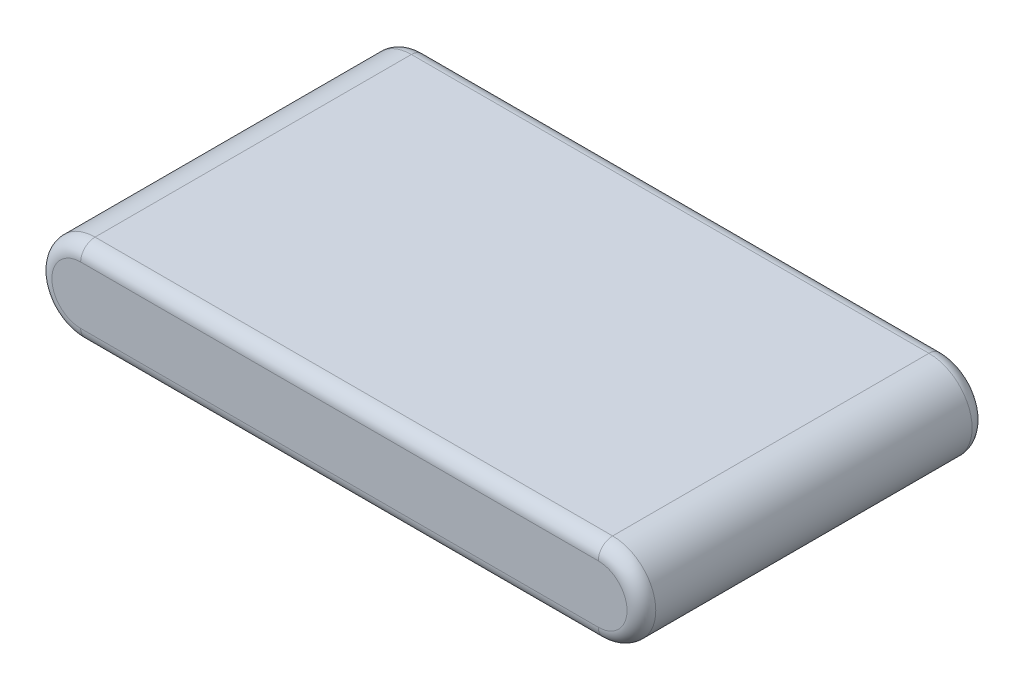
ISO-10303-21;
HEADER;
FILE_DESCRIPTION(('STEP AP214'),'2;1');
FILE_NAME('part.step','',(''),(''),'','','');
FILE_SCHEMA(('AUTOMOTIVE_DESIGN { 1 0 10303 214 1 1 1 1 }'));
ENDSEC;
DATA;
#1=APPLICATION_CONTEXT('core data for automotive mechanical design processes');
#2=APPLICATION_PROTOCOL_DEFINITION('international standard','automotive_design',2000,#1);
#3=PRODUCT_CONTEXT('',#1,'mechanical');
#4=PRODUCT('Part','Part','',(#3));
#5=PRODUCT_RELATED_PRODUCT_CATEGORY('part','',(#4));
#6=PRODUCT_DEFINITION_FORMATION('','',#4);
#7=PRODUCT_DEFINITION_CONTEXT('part definition',#1,'design');
#8=PRODUCT_DEFINITION('design','',#6,#7);
#9=PRODUCT_DEFINITION_SHAPE('','',#8);
#10=(LENGTH_UNIT() NAMED_UNIT(*) SI_UNIT(.MILLI.,.METRE.));
#11=(NAMED_UNIT(*) PLANE_ANGLE_UNIT() SI_UNIT($,.RADIAN.));
#12=(NAMED_UNIT(*) SI_UNIT($,.STERADIAN.) SOLID_ANGLE_UNIT());
#13=UNCERTAINTY_MEASURE_WITH_UNIT(LENGTH_MEASURE(1.E-05),#10,'distance_accuracy_value','');
#14=(GEOMETRIC_REPRESENTATION_CONTEXT(3) GLOBAL_UNCERTAINTY_ASSIGNED_CONTEXT((#13)) GLOBAL_UNIT_ASSIGNED_CONTEXT((#10,
#11,#12)) REPRESENTATION_CONTEXT('',''));
#15=CARTESIAN_POINT('',(0.,0.,0.));
#16=DIRECTION('',(0.,0.,1.));
#17=DIRECTION('',(1.,0.,0.));
#18=AXIS2_PLACEMENT_3D('',#15,#16,#17);
#19=CARTESIAN_POINT('',(9.00000000000001,0.,12.));
#20=DIRECTION('',(0.,0.,-1.));
#21=DIRECTION('',(-1.,0.,0.));
#22=AXIS2_PLACEMENT_3D('',#19,#20,#21);
#23=CYLINDRICAL_SURFACE('',#22,1.5);
#24=DIRECTION('',(0.,0.,-1.));
#25=VECTOR('',#24,1.);
#26=CARTESIAN_POINT('',(9.00000000000001,-1.5,12.));
#27=LINE('',#26,#25);
#28=CARTESIAN_POINT('',(9.00000000000001,-1.5,11.5));
#29=VERTEX_POINT('',#28);
#30=CARTESIAN_POINT('',(9.00000000000001,-1.5,0.5));
#31=VERTEX_POINT('',#30);
#32=EDGE_CURVE('E144',#29,#31,#27,.T.);
#33=ORIENTED_EDGE('',*,*,#32,.T.);
#34=CARTESIAN_POINT('',(9.00000000000001,0.,0.5));
#35=DIRECTION('',(0.,0.,-1.));
#36=DIRECTION('',(-1.,0.,0.));
#37=AXIS2_PLACEMENT_3D('',#34,#35,#36);
#38=CIRCLE('',#37,1.5);
#39=CARTESIAN_POINT('',(9.00000000000001,1.5,0.5));
#40=VERTEX_POINT('',#39);
#41=EDGE_CURVE('E153',#31,#40,#38,.F.);
#42=ORIENTED_EDGE('',*,*,#41,.T.);
#43=DIRECTION('',(0.,0.,-1.));
#44=VECTOR('',#43,1.);
#45=CARTESIAN_POINT('',(9.00000000000001,1.5,12.));
#46=LINE('',#45,#44);
#47=CARTESIAN_POINT('',(9.00000000000001,1.5,11.5));
#48=VERTEX_POINT('',#47);
#49=EDGE_CURVE('E122',#48,#40,#46,.T.);
#50=ORIENTED_EDGE('',*,*,#49,.F.);
#51=CARTESIAN_POINT('',(9.00000000000001,0.,11.5));
#52=DIRECTION('',(0.,0.,-1.));
#53=DIRECTION('',(-1.,0.,0.));
#54=AXIS2_PLACEMENT_3D('',#51,#52,#53);
#55=CIRCLE('',#54,1.5);
#56=EDGE_CURVE('E155',#48,#29,#55,.T.);
#57=ORIENTED_EDGE('',*,*,#56,.T.);
#58=EDGE_LOOP('',(#33,#42,#50,#57));
#59=FACE_BOUND('',#58,.T.);
#60=ADVANCED_FACE('F35',(#59),#23,.T.);
#61=CARTESIAN_POINT('',(9.00000000000001,1.5,12.));
#62=DIRECTION('',(0.,-1.,0.));
#63=DIRECTION('',(0.,0.,-1.));
#64=AXIS2_PLACEMENT_3D('',#61,#62,#63);
#65=PLANE('',#64);
#66=ORIENTED_EDGE('',*,*,#49,.T.);
#67=DIRECTION('',(-1.,0.,0.));
#68=VECTOR('',#67,1.);
#69=CARTESIAN_POINT('',(-9.00000000000001,1.5,0.5));
#70=LINE('',#69,#68);
#71=CARTESIAN_POINT('',(-9.00000000000001,1.5,0.5));
#72=VERTEX_POINT('',#71);
#73=EDGE_CURVE('E121',#40,#72,#70,.T.);
#74=ORIENTED_EDGE('',*,*,#73,.T.);
#75=DIRECTION('',(0.,0.,-1.));
#76=VECTOR('',#75,1.);
#77=CARTESIAN_POINT('',(-9.00000000000001,1.5,12.));
#78=LINE('',#77,#76);
#79=CARTESIAN_POINT('',(-9.00000000000001,1.5,11.5));
#80=VERTEX_POINT('',#79);
#81=EDGE_CURVE('E104',#80,#72,#78,.T.);
#82=ORIENTED_EDGE('',*,*,#81,.F.);
#83=DIRECTION('',(-1.,0.,0.));
#84=VECTOR('',#83,1.);
#85=CARTESIAN_POINT('',(9.00000000000001,1.5,11.5));
#86=LINE('',#85,#84);
#87=EDGE_CURVE('E118',#80,#48,#86,.F.);
#88=ORIENTED_EDGE('',*,*,#87,.T.);
#89=EDGE_LOOP('',(#66,#74,#82,#88));
#90=FACE_BOUND('',#89,.T.);
#91=ADVANCED_FACE('F117',(#90),#65,.F.);
#92=CARTESIAN_POINT('',(-9.00000000000001,0.,12.));
#93=DIRECTION('',(0.,0.,-1.));
#94=DIRECTION('',(-1.,0.,0.));
#95=AXIS2_PLACEMENT_3D('',#92,#93,#94);
#96=CYLINDRICAL_SURFACE('',#95,1.50000000000001);
#97=ORIENTED_EDGE('',*,*,#81,.T.);
#98=CARTESIAN_POINT('',(-9.00000000000001,0.,0.5));
#99=DIRECTION('',(0.,0.,-1.));
#100=DIRECTION('',(-1.,0.,0.));
#101=AXIS2_PLACEMENT_3D('',#98,#99,#100);
#102=CIRCLE('',#101,1.50000000000001);
#103=CARTESIAN_POINT('',(-9.00000000000001,-1.50000000000001,0.5));
#104=VERTEX_POINT('',#103);
#105=EDGE_CURVE('E110',#72,#104,#102,.F.);
#106=ORIENTED_EDGE('',*,*,#105,.T.);
#107=DIRECTION('',(0.,0.,-1.));
#108=VECTOR('',#107,1.);
#109=CARTESIAN_POINT('',(-9.00000000000001,-1.50000000000001,12.));
#110=LINE('',#109,#108);
#111=CARTESIAN_POINT('',(-9.00000000000001,-1.50000000000001,11.5));
#112=VERTEX_POINT('',#111);
#113=EDGE_CURVE('E106',#112,#104,#110,.T.);
#114=ORIENTED_EDGE('',*,*,#113,.F.);
#115=CARTESIAN_POINT('',(-9.00000000000001,0.,11.5));
#116=DIRECTION('',(0.,0.,-1.));
#117=DIRECTION('',(-1.,0.,0.));
#118=AXIS2_PLACEMENT_3D('',#115,#116,#117);
#119=CIRCLE('',#118,1.50000000000001);
#120=EDGE_CURVE('E101',#112,#80,#119,.T.);
#121=ORIENTED_EDGE('',*,*,#120,.T.);
#122=EDGE_LOOP('',(#97,#106,#114,#121));
#123=FACE_BOUND('',#122,.T.);
#124=ADVANCED_FACE('F103',(#123),#96,.T.);
#125=CARTESIAN_POINT('',(9.00000000000001,-1.5,12.));
#126=DIRECTION('',(0.,1.,0.));
#127=DIRECTION('',(-1.,0.,0.));
#128=AXIS2_PLACEMENT_3D('',#125,#126,#127);
#129=PLANE('',#128);
#130=ORIENTED_EDGE('',*,*,#113,.T.);
#131=DIRECTION('',(1.,0.,0.));
#132=VECTOR('',#131,1.);
#133=CARTESIAN_POINT('',(9.00000000000001,-1.5,0.5));
#134=LINE('',#133,#132);
#135=EDGE_CURVE('E157',#104,#31,#134,.T.);
#136=ORIENTED_EDGE('',*,*,#135,.T.);
#137=ORIENTED_EDGE('',*,*,#32,.F.);
#138=DIRECTION('',(1.,0.,0.));
#139=VECTOR('',#138,1.);
#140=CARTESIAN_POINT('',(9.00000000000001,-1.5,11.5));
#141=LINE('',#140,#139);
#142=EDGE_CURVE('E159',#29,#112,#141,.F.);
#143=ORIENTED_EDGE('',*,*,#142,.T.);
#144=EDGE_LOOP('',(#130,#136,#137,#143));
#145=FACE_BOUND('',#144,.T.);
#146=ADVANCED_FACE('F197',(#145),#129,.F.);
#147=CARTESIAN_POINT('',(9.00000000000001,0.,12.));
#148=DIRECTION('',(0.,0.,-1.));
#149=DIRECTION('',(-1.,0.,0.));
#150=AXIS2_PLACEMENT_3D('',#147,#148,#149);
#151=PLANE('',#150);
#152=CARTESIAN_POINT('',(-9.00000000000001,0.,12.));
#153=DIRECTION('',(0.,0.,-1.));
#154=DIRECTION('',(-1.,0.,0.));
#155=AXIS2_PLACEMENT_3D('',#152,#153,#154);
#156=CIRCLE('',#155,1.00000000000001);
#157=CARTESIAN_POINT('',(-9.00000000000001,1.,12.));
#158=VERTEX_POINT('',#157);
#159=CARTESIAN_POINT('',(-9.00000000000001,-1.00000000000001,12.));
#160=VERTEX_POINT('',#159);
#161=EDGE_CURVE('E44',#158,#160,#156,.F.);
#162=ORIENTED_EDGE('',*,*,#161,.T.);
#163=DIRECTION('',(1.,0.,0.));
#164=VECTOR('',#163,1.);
#165=CARTESIAN_POINT('',(9.00000000000001,-1.,12.));
#166=LINE('',#165,#164);
#167=CARTESIAN_POINT('',(9.00000000000001,-1.,12.));
#168=VERTEX_POINT('',#167);
#169=EDGE_CURVE('E11',#160,#168,#166,.T.);
#170=ORIENTED_EDGE('',*,*,#169,.T.);
#171=CARTESIAN_POINT('',(9.00000000000001,0.,12.));
#172=DIRECTION('',(0.,0.,-1.));
#173=DIRECTION('',(-1.,0.,0.));
#174=AXIS2_PLACEMENT_3D('',#171,#172,#173);
#175=CIRCLE('',#174,1.);
#176=CARTESIAN_POINT('',(9.00000000000001,1.,12.));
#177=VERTEX_POINT('',#176);
#178=EDGE_CURVE('E151',#168,#177,#175,.F.);
#179=ORIENTED_EDGE('',*,*,#178,.T.);
#180=DIRECTION('',(-1.,0.,0.));
#181=VECTOR('',#180,1.);
#182=CARTESIAN_POINT('',(9.00000000000001,1.,12.));
#183=LINE('',#182,#181);
#184=EDGE_CURVE('E55',#177,#158,#183,.T.);
#185=ORIENTED_EDGE('',*,*,#184,.T.);
#186=EDGE_LOOP('',(#162,#170,#179,#185));
#187=FACE_BOUND('',#186,.T.);
#188=ADVANCED_FACE('F203',(#187),#151,.F.);
#189=CARTESIAN_POINT('',(9.00000000000001,0.,0.));
#190=DIRECTION('',(0.,0.,-1.));
#191=DIRECTION('',(-1.,0.,0.));
#192=AXIS2_PLACEMENT_3D('',#189,#190,#191);
#193=PLANE('',#192);
#194=CARTESIAN_POINT('',(-9.00000000000001,0.,0.));
#195=DIRECTION('',(0.,0.,-1.));
#196=DIRECTION('',(-1.,0.,0.));
#197=AXIS2_PLACEMENT_3D('',#194,#195,#196);
#198=CIRCLE('',#197,1.00000000000001);
#199=CARTESIAN_POINT('',(-9.00000000000001,-1.00000000000001,0.));
#200=VERTEX_POINT('',#199);
#201=CARTESIAN_POINT('',(-9.00000000000001,1.,0.));
#202=VERTEX_POINT('',#201);
#203=EDGE_CURVE('E164',#200,#202,#198,.T.);
#204=ORIENTED_EDGE('',*,*,#203,.T.);
#205=DIRECTION('',(-1.,0.,0.));
#206=VECTOR('',#205,1.);
#207=CARTESIAN_POINT('',(9.00000000000001,1.,0.));
#208=LINE('',#207,#206);
#209=CARTESIAN_POINT('',(9.00000000000001,1.,0.));
#210=VERTEX_POINT('',#209);
#211=EDGE_CURVE('E111',#202,#210,#208,.F.);
#212=ORIENTED_EDGE('',*,*,#211,.T.);
#213=CARTESIAN_POINT('',(9.00000000000001,0.,0.));
#214=DIRECTION('',(0.,0.,-1.));
#215=DIRECTION('',(-1.,0.,0.));
#216=AXIS2_PLACEMENT_3D('',#213,#214,#215);
#217=CIRCLE('',#216,1.);
#218=CARTESIAN_POINT('',(9.00000000000001,-1.,0.));
#219=VERTEX_POINT('',#218);
#220=EDGE_CURVE('E168',#210,#219,#217,.T.);
#221=ORIENTED_EDGE('',*,*,#220,.T.);
#222=DIRECTION('',(1.,0.,0.));
#223=VECTOR('',#222,1.);
#224=CARTESIAN_POINT('',(-9.00000000000001,-1.00000000000001,0.));
#225=LINE('',#224,#223);
#226=EDGE_CURVE('E166',#219,#200,#225,.F.);
#227=ORIENTED_EDGE('',*,*,#226,.T.);
#228=EDGE_LOOP('',(#204,#212,#221,#227));
#229=FACE_BOUND('',#228,.T.);
#230=ADVANCED_FACE('F205',(#229),#193,.T.);
#231=CARTESIAN_POINT('',(9.00000000000001,-1.,0.5));
#232=DIRECTION('',(-1.,0.,0.));
#233=DIRECTION('',(0.,-1.,0.));
#234=AXIS2_PLACEMENT_3D('',#231,#232,#233);
#235=CYLINDRICAL_SURFACE('',#234,0.5);
#236=CARTESIAN_POINT('',(-9.00000000000001,-1.00000000000001,0.5));
#237=DIRECTION('',(-1.,0.,0.));
#238=DIRECTION('',(0.,0.,1.));
#239=AXIS2_PLACEMENT_3D('',#236,#237,#238);
#240=CIRCLE('',#239,0.5);
#241=EDGE_CURVE('E145',#200,#104,#240,.T.);
#242=ORIENTED_EDGE('',*,*,#241,.F.);
#243=ORIENTED_EDGE('',*,*,#226,.F.);
#244=CARTESIAN_POINT('',(9.00000000000001,-1.,0.5));
#245=DIRECTION('',(1.,0.,0.));
#246=DIRECTION('',(0.,0.,-1.));
#247=AXIS2_PLACEMENT_3D('',#244,#245,#246);
#248=CIRCLE('',#247,0.5);
#249=EDGE_CURVE('E141',#31,#219,#248,.T.);
#250=ORIENTED_EDGE('',*,*,#249,.F.);
#251=ORIENTED_EDGE('',*,*,#135,.F.);
#252=EDGE_LOOP('',(#242,#243,#250,#251));
#253=FACE_BOUND('',#252,.T.);
#254=ADVANCED_FACE('F184',(#253),#235,.T.);
#255=CARTESIAN_POINT('',(9.00000000000001,0.,0.5));
#256=DIRECTION('',(0.,0.,-1.));
#257=DIRECTION('',(-1.,0.,0.));
#258=AXIS2_PLACEMENT_3D('',#255,#256,#257);
#259=TOROIDAL_SURFACE('',#258,1.,0.5);
#260=ORIENTED_EDGE('',*,*,#249,.T.);
#261=ORIENTED_EDGE('',*,*,#220,.F.);
#262=CARTESIAN_POINT('',(9.00000000000001,1.,0.5));
#263=DIRECTION('',(-1.,0.,0.));
#264=DIRECTION('',(0.,0.,1.));
#265=AXIS2_PLACEMENT_3D('',#262,#263,#264);
#266=CIRCLE('',#265,0.5);
#267=EDGE_CURVE('E132',#40,#210,#266,.T.);
#268=ORIENTED_EDGE('',*,*,#267,.F.);
#269=ORIENTED_EDGE('',*,*,#41,.F.);
#270=EDGE_LOOP('',(#260,#261,#268,#269));
#271=FACE_BOUND('',#270,.T.);
#272=ADVANCED_FACE('F188',(#271),#259,.T.);
#273=CARTESIAN_POINT('',(-9.00000000000001,0.,0.5));
#274=DIRECTION('',(0.,0.,-1.));
#275=DIRECTION('',(-1.,0.,0.));
#276=AXIS2_PLACEMENT_3D('',#273,#274,#275);
#277=TOROIDAL_SURFACE('',#276,1.00000000000001,0.5);
#278=ORIENTED_EDGE('',*,*,#241,.T.);
#279=ORIENTED_EDGE('',*,*,#105,.F.);
#280=CARTESIAN_POINT('',(-9.00000000000001,1.,0.5));
#281=DIRECTION('',(1.,0.,0.));
#282=DIRECTION('',(0.,0.,-1.));
#283=AXIS2_PLACEMENT_3D('',#280,#281,#282);
#284=CIRCLE('',#283,0.5);
#285=EDGE_CURVE('E131',#202,#72,#284,.T.);
#286=ORIENTED_EDGE('',*,*,#285,.F.);
#287=ORIENTED_EDGE('',*,*,#203,.F.);
#288=EDGE_LOOP('',(#278,#279,#286,#287));
#289=FACE_BOUND('',#288,.T.);
#290=ADVANCED_FACE('F196',(#289),#277,.T.);
#291=CARTESIAN_POINT('',(9.00000000000001,1.,0.5));
#292=DIRECTION('',(1.,0.,0.));
#293=DIRECTION('',(0.,0.,-1.));
#294=AXIS2_PLACEMENT_3D('',#291,#292,#293);
#295=CYLINDRICAL_SURFACE('',#294,0.5);
#296=ORIENTED_EDGE('',*,*,#267,.T.);
#297=ORIENTED_EDGE('',*,*,#211,.F.);
#298=ORIENTED_EDGE('',*,*,#285,.T.);
#299=ORIENTED_EDGE('',*,*,#73,.F.);
#300=EDGE_LOOP('',(#296,#297,#298,#299));
#301=FACE_BOUND('',#300,.T.);
#302=ADVANCED_FACE('F191',(#301),#295,.T.);
#303=CARTESIAN_POINT('',(9.00000000000001,1.,11.5));
#304=DIRECTION('',(-1.,0.,0.));
#305=DIRECTION('',(0.,0.,1.));
#306=AXIS2_PLACEMENT_3D('',#303,#304,#305);
#307=CYLINDRICAL_SURFACE('',#306,0.5);
#308=CARTESIAN_POINT('',(9.00000000000001,1.,11.5));
#309=DIRECTION('',(1.,0.,0.));
#310=DIRECTION('',(0.,0.,-1.));
#311=AXIS2_PLACEMENT_3D('',#308,#309,#310);
#312=CIRCLE('',#311,0.5);
#313=EDGE_CURVE('E127',#48,#177,#312,.T.);
#314=ORIENTED_EDGE('',*,*,#313,.F.);
#315=ORIENTED_EDGE('',*,*,#87,.F.);
#316=CARTESIAN_POINT('',(-9.00000000000001,1.,11.5));
#317=DIRECTION('',(-1.,0.,0.));
#318=DIRECTION('',(0.,0.,1.));
#319=AXIS2_PLACEMENT_3D('',#316,#317,#318);
#320=CIRCLE('',#319,0.5);
#321=EDGE_CURVE('E39',#158,#80,#320,.T.);
#322=ORIENTED_EDGE('',*,*,#321,.F.);
#323=ORIENTED_EDGE('',*,*,#184,.F.);
#324=EDGE_LOOP('',(#314,#315,#322,#323));
#325=FACE_BOUND('',#324,.T.);
#326=ADVANCED_FACE('F37',(#325),#307,.T.);
#327=CARTESIAN_POINT('',(-9.00000000000001,0.,11.5));
#328=DIRECTION('',(0.,0.,-1.));
#329=DIRECTION('',(-1.,0.,0.));
#330=AXIS2_PLACEMENT_3D('',#327,#328,#329);
#331=TOROIDAL_SURFACE('',#330,1.00000000000001,0.5);
#332=ORIENTED_EDGE('',*,*,#321,.T.);
#333=ORIENTED_EDGE('',*,*,#120,.F.);
#334=CARTESIAN_POINT('',(-9.00000000000001,-1.00000000000001,11.5));
#335=DIRECTION('',(1.,0.,0.));
#336=DIRECTION('',(0.,0.,-1.));
#337=AXIS2_PLACEMENT_3D('',#334,#335,#336);
#338=CIRCLE('',#337,0.5);
#339=EDGE_CURVE('E134',#160,#112,#338,.T.);
#340=ORIENTED_EDGE('',*,*,#339,.F.);
#341=ORIENTED_EDGE('',*,*,#161,.F.);
#342=EDGE_LOOP('',(#332,#333,#340,#341));
#343=FACE_BOUND('',#342,.T.);
#344=ADVANCED_FACE('F130',(#343),#331,.T.);
#345=CARTESIAN_POINT('',(9.00000000000001,0.,11.5));
#346=DIRECTION('',(0.,0.,-1.));
#347=DIRECTION('',(-1.,0.,0.));
#348=AXIS2_PLACEMENT_3D('',#345,#346,#347);
#349=TOROIDAL_SURFACE('',#348,1.,0.5);
#350=ORIENTED_EDGE('',*,*,#313,.T.);
#351=ORIENTED_EDGE('',*,*,#178,.F.);
#352=CARTESIAN_POINT('',(9.00000000000001,-1.,11.5));
#353=DIRECTION('',(-1.,0.,0.));
#354=DIRECTION('',(0.,0.,1.));
#355=AXIS2_PLACEMENT_3D('',#352,#353,#354);
#356=CIRCLE('',#355,0.5);
#357=EDGE_CURVE('E137',#29,#168,#356,.T.);
#358=ORIENTED_EDGE('',*,*,#357,.F.);
#359=ORIENTED_EDGE('',*,*,#56,.F.);
#360=EDGE_LOOP('',(#350,#351,#358,#359));
#361=FACE_BOUND('',#360,.T.);
#362=ADVANCED_FACE('F202',(#361),#349,.T.);
#363=CARTESIAN_POINT('',(9.00000000000001,-1.,11.5));
#364=DIRECTION('',(1.,0.,0.));
#365=DIRECTION('',(0.,1.,0.));
#366=AXIS2_PLACEMENT_3D('',#363,#364,#365);
#367=CYLINDRICAL_SURFACE('',#366,0.5);
#368=ORIENTED_EDGE('',*,*,#339,.T.);
#369=ORIENTED_EDGE('',*,*,#142,.F.);
#370=ORIENTED_EDGE('',*,*,#357,.T.);
#371=ORIENTED_EDGE('',*,*,#169,.F.);
#372=EDGE_LOOP('',(#368,#369,#370,#371));
#373=FACE_BOUND('',#372,.T.);
#374=ADVANCED_FACE('F200',(#373),#367,.T.);
#375=CLOSED_SHELL('',(#60,#91,#124,#146,#188,#230,#254,#272,#290,#302,#326,#344,#362,#374));
#376=MANIFOLD_SOLID_BREP('B2',#375);
#377=ADVANCED_BREP_SHAPE_REPRESENTATION('',(#18,#376),#14);
#378=SHAPE_DEFINITION_REPRESENTATION(#9,#377);
ENDSEC;
END-ISO-10303-21;
